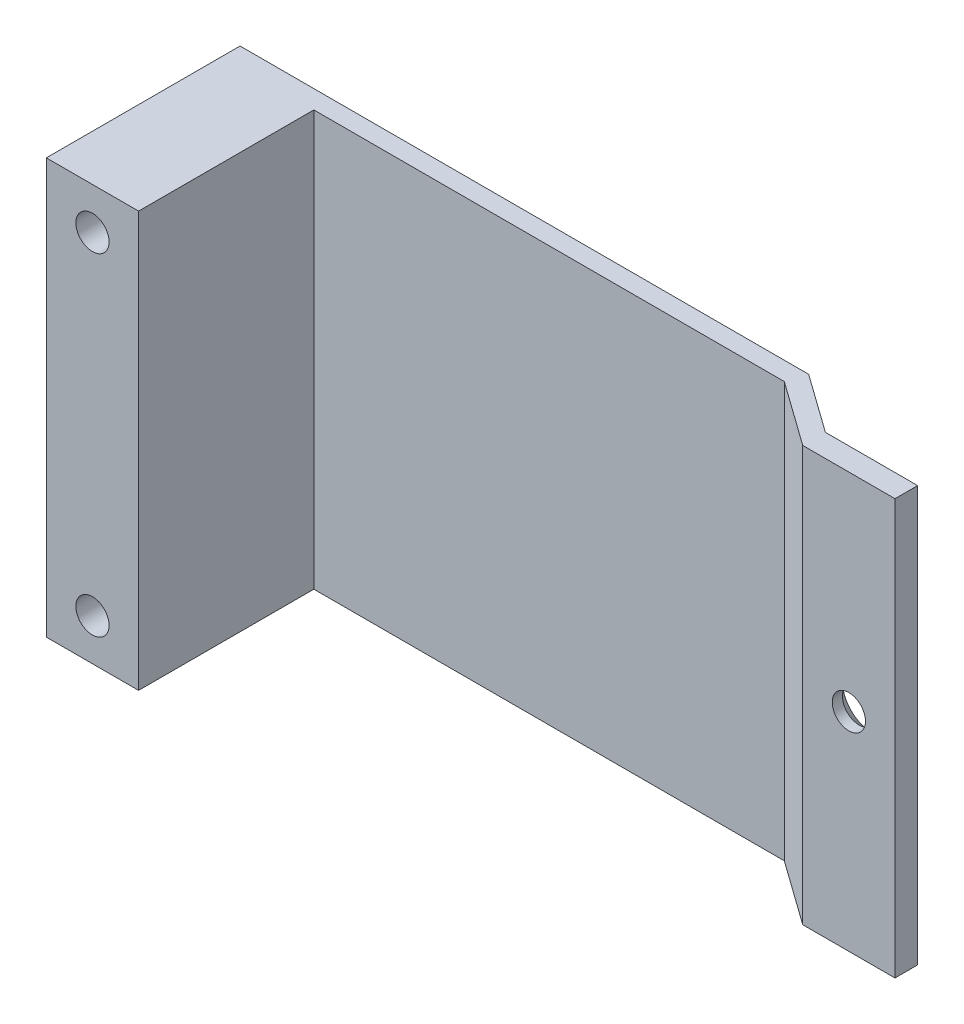
ISO-10303-21;
HEADER;
FILE_DESCRIPTION(('STEP AP214'),'2;1');
FILE_NAME('part.step','',(''),(''),'','','');
FILE_SCHEMA(('AUTOMOTIVE_DESIGN { 1 0 10303 214 1 1 1 1 }'));
ENDSEC;
DATA;
#1=APPLICATION_CONTEXT('core data for automotive mechanical design processes');
#2=APPLICATION_PROTOCOL_DEFINITION('international standard','automotive_design',2000,#1);
#3=PRODUCT_CONTEXT('',#1,'mechanical');
#4=PRODUCT('Part','Part','',(#3));
#5=PRODUCT_RELATED_PRODUCT_CATEGORY('part','',(#4));
#6=PRODUCT_DEFINITION_FORMATION('','',#4);
#7=PRODUCT_DEFINITION_CONTEXT('part definition',#1,'design');
#8=PRODUCT_DEFINITION('design','',#6,#7);
#9=PRODUCT_DEFINITION_SHAPE('','',#8);
#10=(LENGTH_UNIT() NAMED_UNIT(*) SI_UNIT(.MILLI.,.METRE.));
#11=(NAMED_UNIT(*) PLANE_ANGLE_UNIT() SI_UNIT($,.RADIAN.));
#12=(NAMED_UNIT(*) SI_UNIT($,.STERADIAN.) SOLID_ANGLE_UNIT());
#13=UNCERTAINTY_MEASURE_WITH_UNIT(LENGTH_MEASURE(1.E-05),#10,'distance_accuracy_value','');
#14=(GEOMETRIC_REPRESENTATION_CONTEXT(3) GLOBAL_UNCERTAINTY_ASSIGNED_CONTEXT((#13)) GLOBAL_UNIT_ASSIGNED_CONTEXT((#10,
#11,#12)) REPRESENTATION_CONTEXT('',''));
#15=CARTESIAN_POINT('',(0.,0.,0.));
#16=DIRECTION('',(0.,0.,1.));
#17=DIRECTION('',(1.,0.,0.));
#18=AXIS2_PLACEMENT_3D('',#15,#16,#17);
#19=CARTESIAN_POINT('',(29.,40.5,2.54219278084496));
#20=DIRECTION('',(0.,0.,1.));
#21=DIRECTION('',(1.,0.,0.));
#22=AXIS2_PLACEMENT_3D('',#19,#20,#21);
#23=PLANE('',#22);
#24=DIRECTION('',(0.,-1.,0.));
#25=VECTOR('',#24,1.);
#26=CARTESIAN_POINT('',(39.,40.5,2.54219278084496));
#27=LINE('',#26,#25);
#28=CARTESIAN_POINT('',(39.,22.5,2.54219278084496));
#29=VERTEX_POINT('',#28);
#30=CARTESIAN_POINT('',(39.,-22.5,2.54219278084496));
#31=VERTEX_POINT('',#30);
#32=EDGE_CURVE('E113',#29,#31,#27,.T.);
#33=ORIENTED_EDGE('',*,*,#32,.T.);
#34=DIRECTION('',(-1.,0.,0.));
#35=VECTOR('',#34,1.);
#36=CARTESIAN_POINT('',(29.,-22.5,2.54219278084496));
#37=LINE('',#36,#35);
#38=CARTESIAN_POINT('',(29.,-22.5,2.54219278084496));
#39=VERTEX_POINT('',#38);
#40=EDGE_CURVE('E117',#31,#39,#37,.T.);
#41=ORIENTED_EDGE('',*,*,#40,.T.);
#42=DIRECTION('',(0.,-1.,0.));
#43=VECTOR('',#42,1.);
#44=CARTESIAN_POINT('',(29.,40.5,2.54219278084496));
#45=LINE('',#44,#43);
#46=CARTESIAN_POINT('',(29.,22.5,2.54219278084496));
#47=VERTEX_POINT('',#46);
#48=EDGE_CURVE('E123',#47,#39,#45,.T.);
#49=ORIENTED_EDGE('',*,*,#48,.F.);
#50=DIRECTION('',(-1.,0.,0.));
#51=VECTOR('',#50,1.);
#52=CARTESIAN_POINT('',(0.,22.5,2.54219278084496));
#53=LINE('',#52,#51);
#54=EDGE_CURVE('E119',#29,#47,#53,.T.);
#55=ORIENTED_EDGE('',*,*,#54,.F.);
#56=EDGE_LOOP('',(#33,#41,#49,#55));
#57=FACE_BOUND('',#56,.T.);
#58=CARTESIAN_POINT('',(34.,0.,2.54219278084496));
#59=DIRECTION('',(0.,0.,-1.));
#60=DIRECTION('',(-1.,0.,0.));
#61=AXIS2_PLACEMENT_3D('',#58,#59,#60);
#62=CIRCLE('',#61,3.15);
#63=CARTESIAN_POINT('',(30.85,0.,2.54219278084496));
#64=VERTEX_POINT('',#63);
#65=EDGE_CURVE('E215',#64,#64,#62,.T.);
#66=ORIENTED_EDGE('',*,*,#65,.F.);
#67=EDGE_LOOP('',(#66));
#68=FACE_BOUND('',#67,.T.);
#69=ADVANCED_FACE('F34',(#57,#68),#23,.F.);
#70=CARTESIAN_POINT('',(0.,0.,0.));
#71=DIRECTION('',(0.,0.,1.));
#72=DIRECTION('',(1.,0.,0.));
#73=AXIS2_PLACEMENT_3D('',#70,#71,#72);
#74=PLANE('',#73);
#75=DIRECTION('',(1.,0.,0.));
#76=VECTOR('',#75,1.);
#77=CARTESIAN_POINT('',(0.,-22.5,0.));
#78=LINE('',#77,#76);
#79=CARTESIAN_POINT('',(-29.,-22.5,0.));
#80=VERTEX_POINT('',#79);
#81=CARTESIAN_POINT('',(22.,-22.5,0.));
#82=VERTEX_POINT('',#81);
#83=EDGE_CURVE('E176',#80,#82,#78,.T.);
#84=ORIENTED_EDGE('',*,*,#83,.T.);
#85=DIRECTION('',(0.,1.,0.));
#86=VECTOR('',#85,1.);
#87=CARTESIAN_POINT('',(22.,0.,0.));
#88=LINE('',#87,#86);
#89=CARTESIAN_POINT('',(22.,22.5,0.));
#90=VERTEX_POINT('',#89);
#91=EDGE_CURVE('E57',#82,#90,#88,.T.);
#92=ORIENTED_EDGE('',*,*,#91,.T.);
#93=DIRECTION('',(1.,0.,0.));
#94=VECTOR('',#93,1.);
#95=CARTESIAN_POINT('',(0.,22.5,0.));
#96=LINE('',#95,#94);
#97=CARTESIAN_POINT('',(-29.,22.5,0.));
#98=VERTEX_POINT('',#97);
#99=EDGE_CURVE('E154',#98,#90,#96,.T.);
#100=ORIENTED_EDGE('',*,*,#99,.F.);
#101=DIRECTION('',(0.,-1.,0.));
#102=VECTOR('',#101,1.);
#103=CARTESIAN_POINT('',(-29.,0.,0.));
#104=LINE('',#103,#102);
#105=EDGE_CURVE('E169',#98,#80,#104,.T.);
#106=ORIENTED_EDGE('',*,*,#105,.T.);
#107=EDGE_LOOP('',(#84,#92,#100,#106));
#108=FACE_BOUND('',#107,.T.);
#109=ADVANCED_FACE('F250',(#108),#74,.T.);
#110=CARTESIAN_POINT('',(-39.,0.,-2.));
#111=DIRECTION('',(-1.,0.,0.));
#112=DIRECTION('',(0.,-1.,0.));
#113=AXIS2_PLACEMENT_3D('',#110,#111,#112);
#114=PLANE('',#113);
#115=DIRECTION('',(0.,-1.,0.));
#116=VECTOR('',#115,1.);
#117=CARTESIAN_POINT('',(-39.,0.,19.));
#118=LINE('',#117,#116);
#119=CARTESIAN_POINT('',(-39.,22.5,19.));
#120=VERTEX_POINT('',#119);
#121=CARTESIAN_POINT('',(-39.,-22.5,19.));
#122=VERTEX_POINT('',#121);
#123=EDGE_CURVE('E193',#120,#122,#118,.T.);
#124=ORIENTED_EDGE('',*,*,#123,.F.);
#125=DIRECTION('',(0.,0.,1.));
#126=VECTOR('',#125,1.);
#127=CARTESIAN_POINT('',(-39.,22.5,-2.));
#128=LINE('',#127,#126);
#129=CARTESIAN_POINT('',(-39.,22.5,-2.));
#130=VERTEX_POINT('',#129);
#131=EDGE_CURVE('E139',#130,#120,#128,.T.);
#132=ORIENTED_EDGE('',*,*,#131,.F.);
#133=DIRECTION('',(0.,-1.,0.));
#134=VECTOR('',#133,1.);
#135=CARTESIAN_POINT('',(-39.,0.,-2.));
#136=LINE('',#135,#134);
#137=CARTESIAN_POINT('',(-39.,-22.5,-2.));
#138=VERTEX_POINT('',#137);
#139=EDGE_CURVE('E177',#130,#138,#136,.T.);
#140=ORIENTED_EDGE('',*,*,#139,.T.);
#141=DIRECTION('',(0.,0.,1.));
#142=VECTOR('',#141,1.);
#143=CARTESIAN_POINT('',(-39.,-22.5,-2.));
#144=LINE('',#143,#142);
#145=EDGE_CURVE('E137',#138,#122,#144,.T.);
#146=ORIENTED_EDGE('',*,*,#145,.T.);
#147=EDGE_LOOP('',(#124,#132,#140,#146));
#148=FACE_BOUND('',#147,.T.);
#149=ADVANCED_FACE('F194',(#148),#114,.T.);
#150=CARTESIAN_POINT('',(0.,22.5,-2.));
#151=DIRECTION('',(0.,-1.,0.));
#152=DIRECTION('',(0.,0.,-1.));
#153=AXIS2_PLACEMENT_3D('',#150,#151,#152);
#154=PLANE('',#153);
#155=ORIENTED_EDGE('',*,*,#54,.T.);
#156=DIRECTION('',(-0.813733471206733,0.,-0.581238193719098));
#157=VECTOR('',#156,1.);
#158=CARTESIAN_POINT('',(7.64896287392475,22.5,-12.7085480234946));
#159=LINE('',#158,#157);
#160=CARTESIAN_POINT('',(22.6409301068171,22.5,-2.));
#161=VERTEX_POINT('',#160);
#162=EDGE_CURVE('E208',#47,#161,#159,.T.);
#163=ORIENTED_EDGE('',*,*,#162,.T.);
#164=DIRECTION('',(1.,0.,0.));
#165=VECTOR('',#164,1.);
#166=CARTESIAN_POINT('',(0.,22.5,-2.));
#167=LINE('',#166,#165);
#168=EDGE_CURVE('E141',#130,#161,#167,.T.);
#169=ORIENTED_EDGE('',*,*,#168,.F.);
#170=ORIENTED_EDGE('',*,*,#131,.T.);
#171=DIRECTION('',(1.,0.,0.));
#172=VECTOR('',#171,1.);
#173=CARTESIAN_POINT('',(0.,22.5,19.));
#174=LINE('',#173,#172);
#175=CARTESIAN_POINT('',(-29.,22.5,19.));
#176=VERTEX_POINT('',#175);
#177=EDGE_CURVE('E161',#120,#176,#174,.T.);
#178=ORIENTED_EDGE('',*,*,#177,.T.);
#179=DIRECTION('',(0.,0.,-1.));
#180=VECTOR('',#179,1.);
#181=CARTESIAN_POINT('',(-29.,22.5,5.));
#182=LINE('',#181,#180);
#183=EDGE_CURVE('E172',#176,#98,#182,.T.);
#184=ORIENTED_EDGE('',*,*,#183,.T.);
#185=ORIENTED_EDGE('',*,*,#99,.T.);
#186=DIRECTION('',(0.813733471206734,0.,0.581238193719098));
#187=VECTOR('',#186,1.);
#188=CARTESIAN_POINT('',(6.48648648648655,22.5,-11.0810810810811));
#189=LINE('',#188,#187);
#190=CARTESIAN_POINT('',(29.,22.5,5.));
#191=VERTEX_POINT('',#190);
#192=EDGE_CURVE('E43',#90,#191,#189,.T.);
#193=ORIENTED_EDGE('',*,*,#192,.T.);
#194=DIRECTION('',(1.,0.,0.));
#195=VECTOR('',#194,1.);
#196=CARTESIAN_POINT('',(0.,22.5,5.));
#197=LINE('',#196,#195);
#198=CARTESIAN_POINT('',(39.,22.5,5.));
#199=VERTEX_POINT('',#198);
#200=EDGE_CURVE('E153',#191,#199,#197,.T.);
#201=ORIENTED_EDGE('',*,*,#200,.T.);
#202=DIRECTION('',(0.,0.,1.));
#203=VECTOR('',#202,1.);
#204=CARTESIAN_POINT('',(39.,22.5,-2.));
#205=LINE('',#204,#203);
#206=EDGE_CURVE('E136',#29,#199,#205,.T.);
#207=ORIENTED_EDGE('',*,*,#206,.F.);
#208=EDGE_LOOP('',(#155,#163,#169,#170,#178,#184,#185,#193,#201,#207));
#209=FACE_BOUND('',#208,.T.);
#210=ADVANCED_FACE('F152',(#209),#154,.F.);
#211=CARTESIAN_POINT('',(39.,0.,-2.));
#212=DIRECTION('',(-1.,0.,0.));
#213=DIRECTION('',(0.,0.,1.));
#214=AXIS2_PLACEMENT_3D('',#211,#212,#213);
#215=PLANE('',#214);
#216=DIRECTION('',(0.,0.,1.));
#217=VECTOR('',#216,1.);
#218=CARTESIAN_POINT('',(39.,-22.5,-2.));
#219=LINE('',#218,#217);
#220=CARTESIAN_POINT('',(39.,-22.5,5.));
#221=VERTEX_POINT('',#220);
#222=EDGE_CURVE('E128',#31,#221,#219,.T.);
#223=ORIENTED_EDGE('',*,*,#222,.F.);
#224=ORIENTED_EDGE('',*,*,#32,.F.);
#225=ORIENTED_EDGE('',*,*,#206,.T.);
#226=DIRECTION('',(0.,-1.,0.));
#227=VECTOR('',#226,1.);
#228=CARTESIAN_POINT('',(39.,0.,5.));
#229=LINE('',#228,#227);
#230=EDGE_CURVE('E135',#199,#221,#229,.T.);
#231=ORIENTED_EDGE('',*,*,#230,.T.);
#232=EDGE_LOOP('',(#223,#224,#225,#231));
#233=FACE_BOUND('',#232,.T.);
#234=ADVANCED_FACE('F133',(#233),#215,.F.);
#235=CARTESIAN_POINT('',(0.,-22.5,-2.));
#236=DIRECTION('',(0.,-1.,0.));
#237=DIRECTION('',(0.,0.,-1.));
#238=AXIS2_PLACEMENT_3D('',#235,#236,#237);
#239=PLANE('',#238);
#240=DIRECTION('',(-0.813733471206734,0.,-0.581238193719099));
#241=VECTOR('',#240,1.);
#242=CARTESIAN_POINT('',(22.6409301068171,-22.5,-2.));
#243=LINE('',#242,#241);
#244=CARTESIAN_POINT('',(22.6409301068171,-22.5,-2.));
#245=VERTEX_POINT('',#244);
#246=EDGE_CURVE('E50',#39,#245,#243,.T.);
#247=ORIENTED_EDGE('',*,*,#246,.F.);
#248=ORIENTED_EDGE('',*,*,#40,.F.);
#249=ORIENTED_EDGE('',*,*,#222,.T.);
#250=DIRECTION('',(1.,0.,0.));
#251=VECTOR('',#250,1.);
#252=CARTESIAN_POINT('',(0.,-22.5,5.));
#253=LINE('',#252,#251);
#254=CARTESIAN_POINT('',(29.,-22.5,5.));
#255=VERTEX_POINT('',#254);
#256=EDGE_CURVE('E163',#255,#221,#253,.T.);
#257=ORIENTED_EDGE('',*,*,#256,.F.);
#258=DIRECTION('',(-0.813733471206734,0.,-0.581238193719098));
#259=VECTOR('',#258,1.);
#260=CARTESIAN_POINT('',(29.,-22.5,5.));
#261=LINE('',#260,#259);
#262=EDGE_CURVE('E146',#255,#82,#261,.T.);
#263=ORIENTED_EDGE('',*,*,#262,.T.);
#264=ORIENTED_EDGE('',*,*,#83,.F.);
#265=DIRECTION('',(0.,0.,-1.));
#266=VECTOR('',#265,1.);
#267=CARTESIAN_POINT('',(-29.,-22.5,5.));
#268=LINE('',#267,#266);
#269=CARTESIAN_POINT('',(-29.,-22.5,19.));
#270=VERTEX_POINT('',#269);
#271=EDGE_CURVE('E174',#270,#80,#268,.T.);
#272=ORIENTED_EDGE('',*,*,#271,.F.);
#273=DIRECTION('',(1.,0.,0.));
#274=VECTOR('',#273,1.);
#275=CARTESIAN_POINT('',(0.,-22.5,19.));
#276=LINE('',#275,#274);
#277=EDGE_CURVE('E198',#122,#270,#276,.T.);
#278=ORIENTED_EDGE('',*,*,#277,.F.);
#279=ORIENTED_EDGE('',*,*,#145,.F.);
#280=DIRECTION('',(1.,0.,0.));
#281=VECTOR('',#280,1.);
#282=CARTESIAN_POINT('',(0.,-22.5,-2.));
#283=LINE('',#282,#281);
#284=EDGE_CURVE('E180',#138,#245,#283,.T.);
#285=ORIENTED_EDGE('',*,*,#284,.T.);
#286=EDGE_LOOP('',(#247,#248,#249,#257,#263,#264,#272,#278,#279,#285));
#287=FACE_BOUND('',#286,.T.);
#288=ADVANCED_FACE('F126',(#287),#239,.T.);
#289=CARTESIAN_POINT('',(0.,0.,-2.));
#290=DIRECTION('',(0.,0.,1.));
#291=DIRECTION('',(1.,0.,0.));
#292=AXIS2_PLACEMENT_3D('',#289,#290,#291);
#293=PLANE('',#292);
#294=CARTESIAN_POINT('',(-34.,-18.,-2.));
#295=DIRECTION('',(0.,0.,-1.));
#296=DIRECTION('',(-1.,0.,0.));
#297=AXIS2_PLACEMENT_3D('',#294,#295,#296);
#298=CIRCLE('',#297,3.15);
#299=CARTESIAN_POINT('',(-37.15,-18.,-2.));
#300=VERTEX_POINT('',#299);
#301=EDGE_CURVE('E233',#300,#300,#298,.T.);
#302=ORIENTED_EDGE('',*,*,#301,.F.);
#303=EDGE_LOOP('',(#302));
#304=FACE_BOUND('',#303,.T.);
#305=CARTESIAN_POINT('',(-34.,18.,-2.));
#306=DIRECTION('',(0.,0.,-1.));
#307=DIRECTION('',(-1.,0.,0.));
#308=AXIS2_PLACEMENT_3D('',#305,#306,#307);
#309=CIRCLE('',#308,3.15);
#310=CARTESIAN_POINT('',(-37.15,18.,-2.));
#311=VERTEX_POINT('',#310);
#312=EDGE_CURVE('E224',#311,#311,#309,.T.);
#313=ORIENTED_EDGE('',*,*,#312,.F.);
#314=EDGE_LOOP('',(#313));
#315=FACE_BOUND('',#314,.T.);
#316=ORIENTED_EDGE('',*,*,#168,.T.);
#317=DIRECTION('',(0.,-1.,0.));
#318=VECTOR('',#317,1.);
#319=CARTESIAN_POINT('',(22.6409301068171,0.,-2.));
#320=LINE('',#319,#318);
#321=EDGE_CURVE('E11',#161,#245,#320,.T.);
#322=ORIENTED_EDGE('',*,*,#321,.T.);
#323=ORIENTED_EDGE('',*,*,#284,.F.);
#324=ORIENTED_EDGE('',*,*,#139,.F.);
#325=EDGE_LOOP('',(#316,#322,#323,#324));
#326=FACE_BOUND('',#325,.T.);
#327=ADVANCED_FACE('F239',(#304,#315,#326),#293,.F.);
#328=CARTESIAN_POINT('',(-29.,0.,5.));
#329=DIRECTION('',(1.,0.,0.));
#330=DIRECTION('',(0.,1.,0.));
#331=AXIS2_PLACEMENT_3D('',#328,#329,#330);
#332=PLANE('',#331);
#333=ORIENTED_EDGE('',*,*,#105,.F.);
#334=ORIENTED_EDGE('',*,*,#183,.F.);
#335=DIRECTION('',(0.,-1.,0.));
#336=VECTOR('',#335,1.);
#337=CARTESIAN_POINT('',(-29.,0.,19.));
#338=LINE('',#337,#336);
#339=EDGE_CURVE('E203',#176,#270,#338,.T.);
#340=ORIENTED_EDGE('',*,*,#339,.T.);
#341=ORIENTED_EDGE('',*,*,#271,.T.);
#342=EDGE_LOOP('',(#333,#334,#340,#341));
#343=FACE_BOUND('',#342,.T.);
#344=ADVANCED_FACE('F242',(#343),#332,.T.);
#345=CARTESIAN_POINT('',(0.,0.,5.));
#346=DIRECTION('',(0.,0.,1.));
#347=DIRECTION('',(1.,0.,0.));
#348=AXIS2_PLACEMENT_3D('',#345,#346,#347);
#349=PLANE('',#348);
#350=CARTESIAN_POINT('',(34.,0.,5.));
#351=DIRECTION('',(0.,0.,1.));
#352=DIRECTION('',(1.,0.,0.));
#353=AXIS2_PLACEMENT_3D('',#350,#351,#352);
#354=CIRCLE('',#353,1.8);
#355=CARTESIAN_POINT('',(35.8,0.,5.));
#356=VERTEX_POINT('',#355);
#357=EDGE_CURVE('E38',#356,#356,#354,.T.);
#358=ORIENTED_EDGE('',*,*,#357,.F.);
#359=EDGE_LOOP('',(#358));
#360=FACE_BOUND('',#359,.T.);
#361=ORIENTED_EDGE('',*,*,#200,.F.);
#362=DIRECTION('',(0.,-1.,0.));
#363=VECTOR('',#362,1.);
#364=CARTESIAN_POINT('',(29.,0.,5.));
#365=LINE('',#364,#363);
#366=EDGE_CURVE('E160',#191,#255,#365,.T.);
#367=ORIENTED_EDGE('',*,*,#366,.T.);
#368=ORIENTED_EDGE('',*,*,#256,.T.);
#369=ORIENTED_EDGE('',*,*,#230,.F.);
#370=EDGE_LOOP('',(#361,#367,#368,#369));
#371=FACE_BOUND('',#370,.T.);
#372=ADVANCED_FACE('F159',(#360,#371),#349,.T.);
#373=CARTESIAN_POINT('',(0.,0.,19.));
#374=DIRECTION('',(0.,0.,1.));
#375=DIRECTION('',(1.,0.,0.));
#376=AXIS2_PLACEMENT_3D('',#373,#374,#375);
#377=PLANE('',#376);
#378=CARTESIAN_POINT('',(-34.,-18.,19.));
#379=DIRECTION('',(0.,0.,-1.));
#380=DIRECTION('',(-1.,0.,0.));
#381=AXIS2_PLACEMENT_3D('',#378,#379,#380);
#382=CIRCLE('',#381,1.8);
#383=CARTESIAN_POINT('',(-35.8,-18.,19.));
#384=VERTEX_POINT('',#383);
#385=EDGE_CURVE('E227',#384,#384,#382,.T.);
#386=ORIENTED_EDGE('',*,*,#385,.T.);
#387=EDGE_LOOP('',(#386));
#388=FACE_BOUND('',#387,.T.);
#389=CARTESIAN_POINT('',(-34.,18.,19.));
#390=DIRECTION('',(0.,0.,-1.));
#391=DIRECTION('',(-1.,0.,0.));
#392=AXIS2_PLACEMENT_3D('',#389,#390,#391);
#393=CIRCLE('',#392,1.8);
#394=CARTESIAN_POINT('',(-35.8,18.,19.));
#395=VERTEX_POINT('',#394);
#396=EDGE_CURVE('E218',#395,#395,#393,.T.);
#397=ORIENTED_EDGE('',*,*,#396,.T.);
#398=EDGE_LOOP('',(#397));
#399=FACE_BOUND('',#398,.T.);
#400=ORIENTED_EDGE('',*,*,#123,.T.);
#401=ORIENTED_EDGE('',*,*,#277,.T.);
#402=ORIENTED_EDGE('',*,*,#339,.F.);
#403=ORIENTED_EDGE('',*,*,#177,.F.);
#404=EDGE_LOOP('',(#400,#401,#402,#403));
#405=FACE_BOUND('',#404,.T.);
#406=ADVANCED_FACE('F201',(#388,#399,#405),#377,.T.);
#407=CARTESIAN_POINT('',(29.,0.,5.));
#408=DIRECTION('',(0.581238193719098,0.,-0.813733471206733));
#409=DIRECTION('',(0.,-1.,0.));
#410=AXIS2_PLACEMENT_3D('',#407,#408,#409);
#411=PLANE('',#410);
#412=ORIENTED_EDGE('',*,*,#192,.F.);
#413=ORIENTED_EDGE('',*,*,#91,.F.);
#414=ORIENTED_EDGE('',*,*,#262,.F.);
#415=ORIENTED_EDGE('',*,*,#366,.F.);
#416=EDGE_LOOP('',(#412,#413,#414,#415));
#417=FACE_BOUND('',#416,.T.);
#418=ADVANCED_FACE('F36',(#417),#411,.F.);
#419=CARTESIAN_POINT('',(22.6409301068171,40.5,-2.));
#420=DIRECTION('',(-0.581238193719098,0.,0.813733471206733));
#421=DIRECTION('',(0.813733471206733,0.,0.581238193719098));
#422=AXIS2_PLACEMENT_3D('',#419,#420,#421);
#423=PLANE('',#422);
#424=ORIENTED_EDGE('',*,*,#48,.T.);
#425=ORIENTED_EDGE('',*,*,#246,.T.);
#426=ORIENTED_EDGE('',*,*,#321,.F.);
#427=ORIENTED_EDGE('',*,*,#162,.F.);
#428=EDGE_LOOP('',(#424,#425,#426,#427));
#429=FACE_BOUND('',#428,.T.);
#430=ADVANCED_FACE('F304',(#429),#423,.F.);
#431=CARTESIAN_POINT('',(34.,0.,2.54219278084496));
#432=DIRECTION('',(0.,0.,-1.));
#433=DIRECTION('',(-1.,0.,0.));
#434=AXIS2_PLACEMENT_3D('',#431,#432,#433);
#435=CYLINDRICAL_SURFACE('',#434,1.8);
#436=ORIENTED_EDGE('',*,*,#357,.T.);
#437=EDGE_LOOP('',(#436));
#438=FACE_BOUND('',#437,.T.);
#439=CARTESIAN_POINT('',(34.,0.,3.89219278084496));
#440=DIRECTION('',(0.,0.,-1.));
#441=DIRECTION('',(-1.,0.,0.));
#442=AXIS2_PLACEMENT_3D('',#439,#440,#441);
#443=CIRCLE('',#442,1.8);
#444=CARTESIAN_POINT('',(32.2,0.,3.89219278084496));
#445=VERTEX_POINT('',#444);
#446=EDGE_CURVE('E212',#445,#445,#443,.T.);
#447=ORIENTED_EDGE('',*,*,#446,.T.);
#448=EDGE_LOOP('',(#447));
#449=FACE_BOUND('',#448,.T.);
#450=ADVANCED_FACE('F310',(#438,#449),#435,.F.);
#451=CARTESIAN_POINT('',(34.,0.,2.54219278084496));
#452=DIRECTION('',(0.,0.,-1.));
#453=DIRECTION('',(-1.,0.,0.));
#454=AXIS2_PLACEMENT_3D('',#451,#452,#453);
#455=CONICAL_SURFACE('',#454,3.15,0.785398163397446);
#456=ORIENTED_EDGE('',*,*,#446,.F.);
#457=EDGE_LOOP('',(#456));
#458=FACE_BOUND('',#457,.T.);
#459=ORIENTED_EDGE('',*,*,#65,.T.);
#460=EDGE_LOOP('',(#459));
#461=FACE_BOUND('',#460,.T.);
#462=ADVANCED_FACE('F316',(#458,#461),#455,.F.);
#463=CARTESIAN_POINT('',(-34.,18.,-2.));
#464=DIRECTION('',(0.,0.,-1.));
#465=DIRECTION('',(-1.,0.,0.));
#466=AXIS2_PLACEMENT_3D('',#463,#464,#465);
#467=CYLINDRICAL_SURFACE('',#466,1.79999999999999);
#468=ORIENTED_EDGE('',*,*,#396,.F.);
#469=EDGE_LOOP('',(#468));
#470=FACE_BOUND('',#469,.T.);
#471=CARTESIAN_POINT('',(-34.,18.,-0.649999999999996));
#472=DIRECTION('',(0.,0.,-1.));
#473=DIRECTION('',(-1.,0.,0.));
#474=AXIS2_PLACEMENT_3D('',#471,#472,#473);
#475=CIRCLE('',#474,1.79999999999999);
#476=CARTESIAN_POINT('',(-35.8,18.,-0.649999999999996));
#477=VERTEX_POINT('',#476);
#478=EDGE_CURVE('E221',#477,#477,#475,.T.);
#479=ORIENTED_EDGE('',*,*,#478,.T.);
#480=EDGE_LOOP('',(#479));
#481=FACE_BOUND('',#480,.T.);
#482=ADVANCED_FACE('F323',(#470,#481),#467,.F.);
#483=CARTESIAN_POINT('',(-34.,18.,-2.));
#484=DIRECTION('',(0.,0.,-1.));
#485=DIRECTION('',(-1.,0.,0.));
#486=AXIS2_PLACEMENT_3D('',#483,#484,#485);
#487=CONICAL_SURFACE('',#486,3.15,0.78539816339745);
#488=ORIENTED_EDGE('',*,*,#478,.F.);
#489=EDGE_LOOP('',(#488));
#490=FACE_BOUND('',#489,.T.);
#491=ORIENTED_EDGE('',*,*,#312,.T.);
#492=EDGE_LOOP('',(#491));
#493=FACE_BOUND('',#492,.T.);
#494=ADVANCED_FACE('F330',(#490,#493),#487,.F.);
#495=CARTESIAN_POINT('',(-34.,-18.,-2.));
#496=DIRECTION('',(0.,0.,-1.));
#497=DIRECTION('',(-1.,0.,0.));
#498=AXIS2_PLACEMENT_3D('',#495,#496,#497);
#499=CYLINDRICAL_SURFACE('',#498,1.79999999999999);
#500=ORIENTED_EDGE('',*,*,#385,.F.);
#501=EDGE_LOOP('',(#500));
#502=FACE_BOUND('',#501,.T.);
#503=CARTESIAN_POINT('',(-34.,-18.,-0.649999999999996));
#504=DIRECTION('',(0.,0.,-1.));
#505=DIRECTION('',(-1.,0.,0.));
#506=AXIS2_PLACEMENT_3D('',#503,#504,#505);
#507=CIRCLE('',#506,1.79999999999999);
#508=CARTESIAN_POINT('',(-35.8,-18.,-0.649999999999996));
#509=VERTEX_POINT('',#508);
#510=EDGE_CURVE('E230',#509,#509,#507,.T.);
#511=ORIENTED_EDGE('',*,*,#510,.T.);
#512=EDGE_LOOP('',(#511));
#513=FACE_BOUND('',#512,.T.);
#514=ADVANCED_FACE('F338',(#502,#513),#499,.F.);
#515=CARTESIAN_POINT('',(-34.,-18.,-2.));
#516=DIRECTION('',(0.,0.,-1.));
#517=DIRECTION('',(-1.,0.,0.));
#518=AXIS2_PLACEMENT_3D('',#515,#516,#517);
#519=CONICAL_SURFACE('',#518,3.15,0.78539816339745);
#520=ORIENTED_EDGE('',*,*,#510,.F.);
#521=EDGE_LOOP('',(#520));
#522=FACE_BOUND('',#521,.T.);
#523=ORIENTED_EDGE('',*,*,#301,.T.);
#524=EDGE_LOOP('',(#523));
#525=FACE_BOUND('',#524,.T.);
#526=ADVANCED_FACE('F237',(#522,#525),#519,.F.);
#527=CLOSED_SHELL('',(#69,#109,#149,#210,#234,#288,#327,#344,#372,#406,#418,#430,#450,#462,#482,
#494,#514,#526));
#528=MANIFOLD_SOLID_BREP('B2',#527);
#529=ADVANCED_BREP_SHAPE_REPRESENTATION('',(#18,#528),#14);
#530=SHAPE_DEFINITION_REPRESENTATION(#9,#529);
ENDSEC;
END-ISO-10303-21;
